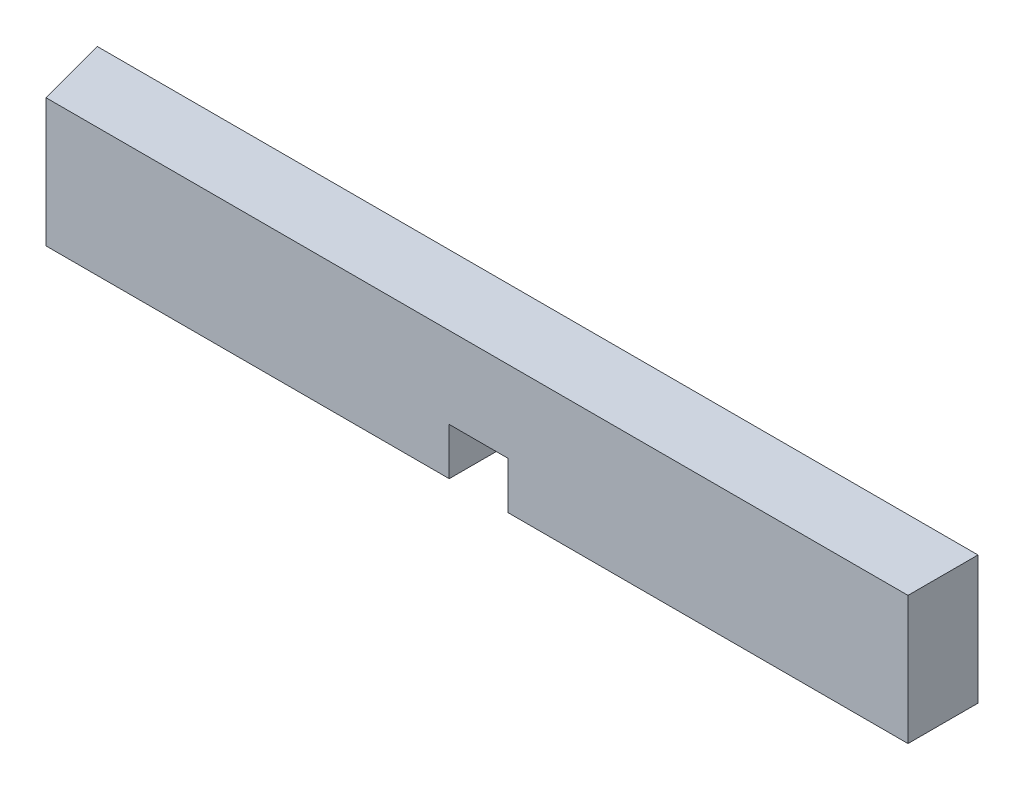
ISO-10303-21;
HEADER;
FILE_DESCRIPTION(('STEP AP214'),'2;1');
FILE_NAME('part.step','',(''),(''),'','','');
FILE_SCHEMA(('AUTOMOTIVE_DESIGN { 1 0 10303 214 1 1 1 1 }'));
ENDSEC;
DATA;
#1=APPLICATION_CONTEXT('core data for automotive mechanical design processes');
#2=APPLICATION_PROTOCOL_DEFINITION('international standard','automotive_design',2000,#1);
#3=PRODUCT_CONTEXT('',#1,'mechanical');
#4=PRODUCT('Part','Part','',(#3));
#5=PRODUCT_RELATED_PRODUCT_CATEGORY('part','',(#4));
#6=PRODUCT_DEFINITION_FORMATION('','',#4);
#7=PRODUCT_DEFINITION_CONTEXT('part definition',#1,'design');
#8=PRODUCT_DEFINITION('design','',#6,#7);
#9=PRODUCT_DEFINITION_SHAPE('','',#8);
#10=(LENGTH_UNIT() NAMED_UNIT(*) SI_UNIT(.MILLI.,.METRE.));
#11=(NAMED_UNIT(*) PLANE_ANGLE_UNIT() SI_UNIT($,.RADIAN.));
#12=(NAMED_UNIT(*) SI_UNIT($,.STERADIAN.) SOLID_ANGLE_UNIT());
#13=UNCERTAINTY_MEASURE_WITH_UNIT(LENGTH_MEASURE(1.E-05),#10,'distance_accuracy_value','');
#14=(GEOMETRIC_REPRESENTATION_CONTEXT(3) GLOBAL_UNCERTAINTY_ASSIGNED_CONTEXT((#13)) GLOBAL_UNIT_ASSIGNED_CONTEXT((#10,
#11,#12)) REPRESENTATION_CONTEXT('',''));
#15=CARTESIAN_POINT('',(0.,0.,0.));
#16=DIRECTION('',(0.,0.,1.));
#17=DIRECTION('',(1.,0.,0.));
#18=AXIS2_PLACEMENT_3D('',#15,#16,#17);
#19=CARTESIAN_POINT('',(0.,0.,4.7244));
#20=DIRECTION('',(0.,1.,0.));
#21=DIRECTION('',(0.,0.,1.));
#22=AXIS2_PLACEMENT_3D('',#19,#20,#21);
#23=PLANE('',#22);
#24=DIRECTION('',(-0.25960106086917,0.,-0.965715946433319));
#25=VECTOR('',#24,1.);
#26=CARTESIAN_POINT('',(0.571499999999996,0.,4.7244));
#27=LINE('',#26,#25);
#28=CARTESIAN_POINT('',(0.571499999999996,0.,4.7244));
#29=VERTEX_POINT('',#28);
#30=CARTESIAN_POINT('',(-0.698499999999998,0.,0.));
#31=VERTEX_POINT('',#30);
#32=EDGE_CURVE('E153',#29,#31,#27,.T.);
#33=ORIENTED_EDGE('',*,*,#32,.T.);
#34=DIRECTION('',(1.,0.,0.));
#35=VECTOR('',#34,1.);
#36=CARTESIAN_POINT('',(0.,0.,0.));
#37=LINE('',#36,#35);
#38=CARTESIAN_POINT('',(27.78125,0.,0.));
#39=VERTEX_POINT('',#38);
#40=EDGE_CURVE('E81',#31,#39,#37,.T.);
#41=ORIENTED_EDGE('',*,*,#40,.T.);
#42=DIRECTION('',(0.,0.,1.));
#43=VECTOR('',#42,1.);
#44=CARTESIAN_POINT('',(27.78125,0.,-1.2E-05));
#45=LINE('',#44,#43);
#46=CARTESIAN_POINT('',(27.78125,0.,4.7244));
#47=VERTEX_POINT('',#46);
#48=EDGE_CURVE('E127',#39,#47,#45,.T.);
#49=ORIENTED_EDGE('',*,*,#48,.T.);
#50=DIRECTION('',(1.,0.,0.));
#51=VECTOR('',#50,1.);
#52=CARTESIAN_POINT('',(0.,0.,4.7244));
#53=LINE('',#52,#51);
#54=EDGE_CURVE('E98',#29,#47,#53,.T.);
#55=ORIENTED_EDGE('',*,*,#54,.F.);
#56=EDGE_LOOP('',(#33,#41,#49,#55));
#57=FACE_BOUND('',#56,.T.);
#58=ADVANCED_FACE('F33',(#57),#23,.F.);
#59=CARTESIAN_POINT('',(0.,8.6614,4.7244));
#60=DIRECTION('',(0.,-1.,0.));
#61=DIRECTION('',(0.,0.,-1.));
#62=AXIS2_PLACEMENT_3D('',#59,#60,#61);
#63=PLANE('',#62);
#64=DIRECTION('',(-1.,0.,0.));
#65=VECTOR('',#64,1.);
#66=CARTESIAN_POINT('',(0.,8.6614,0.));
#67=LINE('',#66,#65);
#68=CARTESIAN_POINT('',(58.7375,8.6614,0.));
#69=VERTEX_POINT('',#68);
#70=CARTESIAN_POINT('',(-0.698499999999998,8.6614,0.));
#71=VERTEX_POINT('',#70);
#72=EDGE_CURVE('E80',#69,#71,#67,.T.);
#73=ORIENTED_EDGE('',*,*,#72,.T.);
#74=DIRECTION('',(-0.25960106086917,0.,-0.965715946433319));
#75=VECTOR('',#74,1.);
#76=CARTESIAN_POINT('',(0.571499999999996,8.6614,4.7244));
#77=LINE('',#76,#75);
#78=CARTESIAN_POINT('',(0.571499999999996,8.6614,4.7244));
#79=VERTEX_POINT('',#78);
#80=EDGE_CURVE('E154',#79,#71,#77,.T.);
#81=ORIENTED_EDGE('',*,*,#80,.F.);
#82=DIRECTION('',(-1.,0.,0.));
#83=VECTOR('',#82,1.);
#84=CARTESIAN_POINT('',(0.,8.6614,4.7244));
#85=LINE('',#84,#83);
#86=CARTESIAN_POINT('',(58.7375,8.6614,4.7244));
#87=VERTEX_POINT('',#86);
#88=EDGE_CURVE('E89',#87,#79,#85,.T.);
#89=ORIENTED_EDGE('',*,*,#88,.F.);
#90=DIRECTION('',(0.,0.,-1.));
#91=VECTOR('',#90,1.);
#92=CARTESIAN_POINT('',(58.7375,8.6614,4.7244));
#93=LINE('',#92,#91);
#94=EDGE_CURVE('E73',#87,#69,#93,.T.);
#95=ORIENTED_EDGE('',*,*,#94,.T.);
#96=EDGE_LOOP('',(#73,#81,#89,#95));
#97=FACE_BOUND('',#96,.T.);
#98=ADVANCED_FACE('F85',(#97),#63,.F.);
#99=CARTESIAN_POINT('',(0.,0.,4.7244));
#100=DIRECTION('',(0.,0.,-1.));
#101=DIRECTION('',(-1.,0.,0.));
#102=AXIS2_PLACEMENT_3D('',#99,#100,#101);
#103=PLANE('',#102);
#104=DIRECTION('',(0.,1.,0.));
#105=VECTOR('',#104,1.);
#106=CARTESIAN_POINT('',(0.571499999999996,0.,4.7244));
#107=LINE('',#106,#105);
#108=EDGE_CURVE('E149',#29,#79,#107,.T.);
#109=ORIENTED_EDGE('',*,*,#108,.F.);
#110=ORIENTED_EDGE('',*,*,#54,.T.);
#111=DIRECTION('',(0.,-1.,0.));
#112=VECTOR('',#111,1.);
#113=CARTESIAN_POINT('',(27.78125,0.,4.7244));
#114=LINE('',#113,#112);
#115=CARTESIAN_POINT('',(27.78125,3.175,4.7244));
#116=VERTEX_POINT('',#115);
#117=EDGE_CURVE('E147',#116,#47,#114,.T.);
#118=ORIENTED_EDGE('',*,*,#117,.F.);
#119=DIRECTION('',(-1.,0.,0.));
#120=VECTOR('',#119,1.);
#121=CARTESIAN_POINT('',(27.78125,3.175,4.7244));
#122=LINE('',#121,#120);
#123=CARTESIAN_POINT('',(31.75,3.175,4.7244));
#124=VERTEX_POINT('',#123);
#125=EDGE_CURVE('E131',#124,#116,#122,.T.);
#126=ORIENTED_EDGE('',*,*,#125,.F.);
#127=DIRECTION('',(0.,1.,0.));
#128=VECTOR('',#127,1.);
#129=CARTESIAN_POINT('',(31.75,0.,4.7244));
#130=LINE('',#129,#128);
#131=CARTESIAN_POINT('',(31.75,0.,4.7244));
#132=VERTEX_POINT('',#131);
#133=EDGE_CURVE('E145',#132,#124,#130,.T.);
#134=ORIENTED_EDGE('',*,*,#133,.F.);
#135=CARTESIAN_POINT('',(58.7375,0.,4.7244));
#136=VERTEX_POINT('',#135);
#137=EDGE_CURVE('E96',#132,#136,#53,.T.);
#138=ORIENTED_EDGE('',*,*,#137,.T.);
#139=DIRECTION('',(0.,1.,0.));
#140=VECTOR('',#139,1.);
#141=CARTESIAN_POINT('',(58.7375,0.,4.7244));
#142=LINE('',#141,#140);
#143=EDGE_CURVE('E57',#136,#87,#142,.T.);
#144=ORIENTED_EDGE('',*,*,#143,.T.);
#145=ORIENTED_EDGE('',*,*,#88,.T.);
#146=EDGE_LOOP('',(#109,#110,#118,#126,#134,#138,#144,#145));
#147=FACE_BOUND('',#146,.T.);
#148=ADVANCED_FACE('F177',(#147),#103,.F.);
#149=ORIENTED_EDGE('',*,*,#137,.F.);
#150=DIRECTION('',(0.,0.,1.));
#151=VECTOR('',#150,1.);
#152=CARTESIAN_POINT('',(31.75,0.,-1.2E-05));
#153=LINE('',#152,#151);
#154=CARTESIAN_POINT('',(31.75,0.,0.));
#155=VERTEX_POINT('',#154);
#156=EDGE_CURVE('E120',#155,#132,#153,.T.);
#157=ORIENTED_EDGE('',*,*,#156,.F.);
#158=CARTESIAN_POINT('',(58.7375,0.,0.));
#159=VERTEX_POINT('',#158);
#160=EDGE_CURVE('E115',#155,#159,#37,.T.);
#161=ORIENTED_EDGE('',*,*,#160,.T.);
#162=DIRECTION('',(0.,0.,-1.));
#163=VECTOR('',#162,1.);
#164=CARTESIAN_POINT('',(58.7375,0.,4.7244));
#165=LINE('',#164,#163);
#166=EDGE_CURVE('E76',#136,#159,#165,.T.);
#167=ORIENTED_EDGE('',*,*,#166,.F.);
#168=EDGE_LOOP('',(#149,#157,#161,#167));
#169=FACE_BOUND('',#168,.T.);
#170=ADVANCED_FACE('F35',(#169),#23,.F.);
#171=CARTESIAN_POINT('',(58.7375,0.,4.7244));
#172=DIRECTION('',(-1.,0.,0.));
#173=DIRECTION('',(0.,0.,1.));
#174=AXIS2_PLACEMENT_3D('',#171,#172,#173);
#175=PLANE('',#174);
#176=DIRECTION('',(0.,1.,0.));
#177=VECTOR('',#176,1.);
#178=CARTESIAN_POINT('',(58.7375,0.,0.));
#179=LINE('',#178,#177);
#180=EDGE_CURVE('E70',#159,#69,#179,.T.);
#181=ORIENTED_EDGE('',*,*,#180,.T.);
#182=ORIENTED_EDGE('',*,*,#94,.F.);
#183=ORIENTED_EDGE('',*,*,#143,.F.);
#184=ORIENTED_EDGE('',*,*,#166,.T.);
#185=EDGE_LOOP('',(#181,#182,#183,#184));
#186=FACE_BOUND('',#185,.T.);
#187=ADVANCED_FACE('F72',(#186),#175,.F.);
#188=CARTESIAN_POINT('',(0.,0.,0.));
#189=DIRECTION('',(0.,0.,-1.));
#190=DIRECTION('',(-1.,0.,0.));
#191=AXIS2_PLACEMENT_3D('',#188,#189,#190);
#192=PLANE('',#191);
#193=DIRECTION('',(0.,1.,0.));
#194=VECTOR('',#193,1.);
#195=CARTESIAN_POINT('',(-0.698499999999998,0.,0.));
#196=LINE('',#195,#194);
#197=EDGE_CURVE('E94',#31,#71,#196,.T.);
#198=ORIENTED_EDGE('',*,*,#197,.T.);
#199=ORIENTED_EDGE('',*,*,#72,.F.);
#200=ORIENTED_EDGE('',*,*,#180,.F.);
#201=ORIENTED_EDGE('',*,*,#160,.F.);
#202=DIRECTION('',(0.,-1.,0.));
#203=VECTOR('',#202,1.);
#204=CARTESIAN_POINT('',(31.75,0.,0.));
#205=LINE('',#204,#203);
#206=CARTESIAN_POINT('',(31.75,3.175,0.));
#207=VERTEX_POINT('',#206);
#208=EDGE_CURVE('E103',#207,#155,#205,.T.);
#209=ORIENTED_EDGE('',*,*,#208,.F.);
#210=DIRECTION('',(1.,0.,0.));
#211=VECTOR('',#210,1.);
#212=CARTESIAN_POINT('',(0.,3.175,0.));
#213=LINE('',#212,#211);
#214=CARTESIAN_POINT('',(27.78125,3.175,0.));
#215=VERTEX_POINT('',#214);
#216=EDGE_CURVE('E41',#215,#207,#213,.T.);
#217=ORIENTED_EDGE('',*,*,#216,.F.);
#218=DIRECTION('',(0.,1.,0.));
#219=VECTOR('',#218,1.);
#220=CARTESIAN_POINT('',(27.78125,0.,0.));
#221=LINE('',#220,#219);
#222=EDGE_CURVE('E11',#39,#215,#221,.T.);
#223=ORIENTED_EDGE('',*,*,#222,.F.);
#224=ORIENTED_EDGE('',*,*,#40,.F.);
#225=EDGE_LOOP('',(#198,#199,#200,#201,#209,#217,#223,#224));
#226=FACE_BOUND('',#225,.T.);
#227=ADVANCED_FACE('F91',(#226),#192,.T.);
#228=CARTESIAN_POINT('',(27.78125,0.,-1.2E-05));
#229=DIRECTION('',(-1.,0.,0.));
#230=DIRECTION('',(0.,0.,1.));
#231=AXIS2_PLACEMENT_3D('',#228,#229,#230);
#232=PLANE('',#231);
#233=ORIENTED_EDGE('',*,*,#222,.T.);
#234=DIRECTION('',(0.,0.,1.));
#235=VECTOR('',#234,1.);
#236=CARTESIAN_POINT('',(27.78125,3.175,-1.2E-05));
#237=LINE('',#236,#235);
#238=EDGE_CURVE('E112',#215,#116,#237,.T.);
#239=ORIENTED_EDGE('',*,*,#238,.T.);
#240=ORIENTED_EDGE('',*,*,#117,.T.);
#241=ORIENTED_EDGE('',*,*,#48,.F.);
#242=EDGE_LOOP('',(#233,#239,#240,#241));
#243=FACE_BOUND('',#242,.T.);
#244=ADVANCED_FACE('F174',(#243),#232,.F.);
#245=CARTESIAN_POINT('',(27.78125,3.175,-1.2E-05));
#246=DIRECTION('',(0.,1.,0.));
#247=DIRECTION('',(0.,0.,1.));
#248=AXIS2_PLACEMENT_3D('',#245,#246,#247);
#249=PLANE('',#248);
#250=ORIENTED_EDGE('',*,*,#216,.T.);
#251=DIRECTION('',(0.,0.,1.));
#252=VECTOR('',#251,1.);
#253=CARTESIAN_POINT('',(31.75,3.175,-1.2E-05));
#254=LINE('',#253,#252);
#255=EDGE_CURVE('E48',#207,#124,#254,.T.);
#256=ORIENTED_EDGE('',*,*,#255,.T.);
#257=ORIENTED_EDGE('',*,*,#125,.T.);
#258=ORIENTED_EDGE('',*,*,#238,.F.);
#259=EDGE_LOOP('',(#250,#256,#257,#258));
#260=FACE_BOUND('',#259,.T.);
#261=ADVANCED_FACE('F108',(#260),#249,.F.);
#262=CARTESIAN_POINT('',(31.75,0.,-1.2E-05));
#263=DIRECTION('',(1.,0.,0.));
#264=DIRECTION('',(0.,0.,-1.));
#265=AXIS2_PLACEMENT_3D('',#262,#263,#264);
#266=PLANE('',#265);
#267=ORIENTED_EDGE('',*,*,#208,.T.);
#268=ORIENTED_EDGE('',*,*,#156,.T.);
#269=ORIENTED_EDGE('',*,*,#133,.T.);
#270=ORIENTED_EDGE('',*,*,#255,.F.);
#271=EDGE_LOOP('',(#267,#268,#269,#270));
#272=FACE_BOUND('',#271,.T.);
#273=ADVANCED_FACE('F118',(#272),#266,.F.);
#274=CARTESIAN_POINT('',(0.571499999999996,0.,4.7244));
#275=DIRECTION('',(0.965715946433319,0.,-0.25960106086917));
#276=DIRECTION('',(-0.25960106086917,0.,-0.965715946433319));
#277=AXIS2_PLACEMENT_3D('',#274,#275,#276);
#278=PLANE('',#277);
#279=ORIENTED_EDGE('',*,*,#80,.T.);
#280=ORIENTED_EDGE('',*,*,#197,.F.);
#281=ORIENTED_EDGE('',*,*,#32,.F.);
#282=ORIENTED_EDGE('',*,*,#108,.T.);
#283=EDGE_LOOP('',(#279,#280,#281,#282));
#284=FACE_BOUND('',#283,.T.);
#285=ADVANCED_FACE('F163',(#284),#278,.F.);
#286=CLOSED_SHELL('',(#58,#98,#148,#170,#187,#227,#244,#261,#273,#285));
#287=MANIFOLD_SOLID_BREP('B2',#286);
#288=ADVANCED_BREP_SHAPE_REPRESENTATION('',(#18,#287),#14);
#289=SHAPE_DEFINITION_REPRESENTATION(#9,#288);
ENDSEC;
END-ISO-10303-21;
